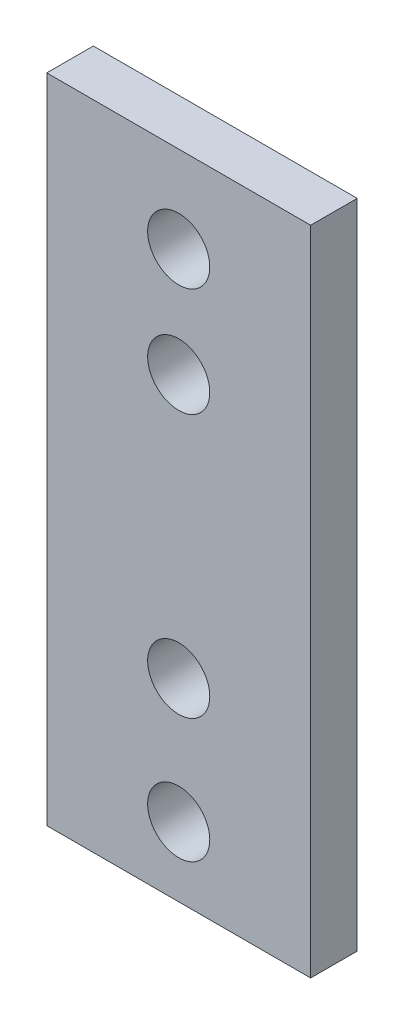
ISO-10303-21;
HEADER;
FILE_DESCRIPTION(('STEP AP214'),'2;1');
FILE_NAME('part.step','',(''),(''),'','','');
FILE_SCHEMA(('AUTOMOTIVE_DESIGN { 1 0 10303 214 1 1 1 1 }'));
ENDSEC;
DATA;
#1=APPLICATION_CONTEXT('core data for automotive mechanical design processes');
#2=APPLICATION_PROTOCOL_DEFINITION('international standard','automotive_design',2000,#1);
#3=PRODUCT_CONTEXT('',#1,'mechanical');
#4=PRODUCT('Part','Part','',(#3));
#5=PRODUCT_RELATED_PRODUCT_CATEGORY('part','',(#4));
#6=PRODUCT_DEFINITION_FORMATION('','',#4);
#7=PRODUCT_DEFINITION_CONTEXT('part definition',#1,'design');
#8=PRODUCT_DEFINITION('design','',#6,#7);
#9=PRODUCT_DEFINITION_SHAPE('','',#8);
#10=(LENGTH_UNIT() NAMED_UNIT(*) SI_UNIT(.MILLI.,.METRE.));
#11=(NAMED_UNIT(*) PLANE_ANGLE_UNIT() SI_UNIT($,.RADIAN.));
#12=(NAMED_UNIT(*) SI_UNIT($,.STERADIAN.) SOLID_ANGLE_UNIT());
#13=UNCERTAINTY_MEASURE_WITH_UNIT(LENGTH_MEASURE(1.E-05),#10,'distance_accuracy_value','');
#14=(GEOMETRIC_REPRESENTATION_CONTEXT(3) GLOBAL_UNCERTAINTY_ASSIGNED_CONTEXT((#13)) GLOBAL_UNIT_ASSIGNED_CONTEXT((#10,
#11,#12)) REPRESENTATION_CONTEXT('',''));
#15=CARTESIAN_POINT('',(0.,0.,0.));
#16=DIRECTION('',(0.,0.,1.));
#17=DIRECTION('',(1.,0.,0.));
#18=AXIS2_PLACEMENT_3D('',#15,#16,#17);
#19=CARTESIAN_POINT('',(0.,0.,3.));
#20=DIRECTION('',(0.,0.,1.));
#21=DIRECTION('',(1.,0.,0.));
#22=AXIS2_PLACEMENT_3D('',#19,#20,#21);
#23=PLANE('',#22);
#24=CARTESIAN_POINT('',(-5.84751773049646,-14.0035460992908,3.));
#25=DIRECTION('',(0.,0.,1.));
#26=DIRECTION('',(1.,0.,0.));
#27=AXIS2_PLACEMENT_3D('',#24,#25,#26);
#28=CIRCLE('',#27,2.);
#29=CARTESIAN_POINT('',(-3.84751773049646,-14.0035460992908,3.));
#30=VERTEX_POINT('',#29);
#31=EDGE_CURVE('E142',#30,#30,#28,.T.);
#32=ORIENTED_EDGE('',*,*,#31,.F.);
#33=EDGE_LOOP('',(#32));
#34=FACE_BOUND('',#33,.T.);
#35=CARTESIAN_POINT('',(-5.84751773049647,9.95390070921986,3.));
#36=DIRECTION('',(0.,0.,1.));
#37=DIRECTION('',(1.,0.,0.));
#38=AXIS2_PLACEMENT_3D('',#35,#36,#37);
#39=CIRCLE('',#38,2.);
#40=CARTESIAN_POINT('',(-3.84751773049647,9.95390070921986,3.));
#41=VERTEX_POINT('',#40);
#42=EDGE_CURVE('E112',#41,#41,#39,.T.);
#43=ORIENTED_EDGE('',*,*,#42,.F.);
#44=EDGE_LOOP('',(#43));
#45=FACE_BOUND('',#44,.T.);
#46=DIRECTION('',(0.,-1.,0.));
#47=VECTOR('',#46,1.);
#48=CARTESIAN_POINT('',(-14.3475177304965,15.5354609929078,3.));
#49=LINE('',#48,#47);
#50=CARTESIAN_POINT('',(-14.3475177304965,15.5354609929078,3.));
#51=VERTEX_POINT('',#50);
#52=CARTESIAN_POINT('',(-14.3475177304965,-26.4645390070922,3.));
#53=VERTEX_POINT('',#52);
#54=EDGE_CURVE('E92',#51,#53,#49,.T.);
#55=ORIENTED_EDGE('',*,*,#54,.T.);
#56=DIRECTION('',(1.,0.,0.));
#57=VECTOR('',#56,1.);
#58=CARTESIAN_POINT('',(-14.3475177304965,-26.4645390070922,3.));
#59=LINE('',#58,#57);
#60=CARTESIAN_POINT('',(2.65248226950354,-26.4645390070922,3.));
#61=VERTEX_POINT('',#60);
#62=EDGE_CURVE('E87',#53,#61,#59,.T.);
#63=ORIENTED_EDGE('',*,*,#62,.T.);
#64=DIRECTION('',(0.,1.,0.));
#65=VECTOR('',#64,1.);
#66=CARTESIAN_POINT('',(2.65248226950353,15.5354609929078,3.));
#67=LINE('',#66,#65);
#68=CARTESIAN_POINT('',(2.65248226950353,15.5354609929078,3.));
#69=VERTEX_POINT('',#68);
#70=EDGE_CURVE('E90',#61,#69,#67,.T.);
#71=ORIENTED_EDGE('',*,*,#70,.T.);
#72=DIRECTION('',(-1.,0.,0.));
#73=VECTOR('',#72,1.);
#74=CARTESIAN_POINT('',(-14.3475177304965,15.5354609929078,3.));
#75=LINE('',#74,#73);
#76=EDGE_CURVE('E57',#69,#51,#75,.T.);
#77=ORIENTED_EDGE('',*,*,#76,.T.);
#78=EDGE_LOOP('',(#55,#63,#71,#77));
#79=FACE_BOUND('',#78,.T.);
#80=CARTESIAN_POINT('',(-5.84751773049647,2.95390070921986,3.));
#81=DIRECTION('',(0.,0.,1.));
#82=DIRECTION('',(1.,0.,0.));
#83=AXIS2_PLACEMENT_3D('',#80,#81,#82);
#84=CIRCLE('',#83,2.);
#85=CARTESIAN_POINT('',(-3.84751773049647,2.95390070921986,3.));
#86=VERTEX_POINT('',#85);
#87=EDGE_CURVE('E134',#86,#86,#84,.T.);
#88=ORIENTED_EDGE('',*,*,#87,.F.);
#89=EDGE_LOOP('',(#88));
#90=FACE_BOUND('',#89,.T.);
#91=CARTESIAN_POINT('',(-5.84751773049646,-22.0035460992908,3.));
#92=DIRECTION('',(0.,0.,1.));
#93=DIRECTION('',(1.,0.,0.));
#94=AXIS2_PLACEMENT_3D('',#91,#92,#93);
#95=CIRCLE('',#94,2.);
#96=CARTESIAN_POINT('',(-3.84751773049646,-22.0035460992908,3.));
#97=VERTEX_POINT('',#96);
#98=EDGE_CURVE('E150',#97,#97,#95,.T.);
#99=ORIENTED_EDGE('',*,*,#98,.F.);
#100=EDGE_LOOP('',(#99));
#101=FACE_BOUND('',#100,.T.);
#102=ADVANCED_FACE('F39',(#34,#45,#79,#90,#101),#23,.T.);
#103=CARTESIAN_POINT('',(0.,0.,0.));
#104=DIRECTION('',(0.,0.,1.));
#105=DIRECTION('',(1.,0.,0.));
#106=AXIS2_PLACEMENT_3D('',#103,#104,#105);
#107=PLANE('',#106);
#108=DIRECTION('',(0.,-1.,0.));
#109=VECTOR('',#108,1.);
#110=CARTESIAN_POINT('',(-14.3475177304965,15.5354609929078,0.));
#111=LINE('',#110,#109);
#112=CARTESIAN_POINT('',(-14.3475177304965,15.5354609929078,0.));
#113=VERTEX_POINT('',#112);
#114=CARTESIAN_POINT('',(-14.3475177304965,-26.4645390070922,0.));
#115=VERTEX_POINT('',#114);
#116=EDGE_CURVE('E108',#113,#115,#111,.T.);
#117=ORIENTED_EDGE('',*,*,#116,.F.);
#118=DIRECTION('',(-1.,0.,0.));
#119=VECTOR('',#118,1.);
#120=CARTESIAN_POINT('',(-14.3475177304965,15.5354609929078,0.));
#121=LINE('',#120,#119);
#122=CARTESIAN_POINT('',(2.65248226950353,15.5354609929078,0.));
#123=VERTEX_POINT('',#122);
#124=EDGE_CURVE('E80',#123,#113,#121,.T.);
#125=ORIENTED_EDGE('',*,*,#124,.F.);
#126=DIRECTION('',(0.,1.,0.));
#127=VECTOR('',#126,1.);
#128=CARTESIAN_POINT('',(2.65248226950353,15.5354609929078,0.));
#129=LINE('',#128,#127);
#130=CARTESIAN_POINT('',(2.65248226950354,-26.4645390070922,0.));
#131=VERTEX_POINT('',#130);
#132=EDGE_CURVE('E74',#131,#123,#129,.T.);
#133=ORIENTED_EDGE('',*,*,#132,.F.);
#134=DIRECTION('',(1.,0.,0.));
#135=VECTOR('',#134,1.);
#136=CARTESIAN_POINT('',(-14.3475177304965,-26.4645390070922,0.));
#137=LINE('',#136,#135);
#138=EDGE_CURVE('E97',#115,#131,#137,.T.);
#139=ORIENTED_EDGE('',*,*,#138,.F.);
#140=EDGE_LOOP('',(#117,#125,#133,#139));
#141=FACE_BOUND('',#140,.T.);
#142=CARTESIAN_POINT('',(-5.84751773049647,9.95390070921986,0.));
#143=DIRECTION('',(0.,0.,1.));
#144=DIRECTION('',(1.,0.,0.));
#145=AXIS2_PLACEMENT_3D('',#142,#143,#144);
#146=CIRCLE('',#145,2.);
#147=CARTESIAN_POINT('',(-3.84751773049647,9.95390070921986,0.));
#148=VERTEX_POINT('',#147);
#149=EDGE_CURVE('E130',#148,#148,#146,.T.);
#150=ORIENTED_EDGE('',*,*,#149,.T.);
#151=EDGE_LOOP('',(#150));
#152=FACE_BOUND('',#151,.T.);
#153=CARTESIAN_POINT('',(-5.84751773049647,2.95390070921986,0.));
#154=DIRECTION('',(0.,0.,1.));
#155=DIRECTION('',(1.,0.,0.));
#156=AXIS2_PLACEMENT_3D('',#153,#154,#155);
#157=CIRCLE('',#156,2.);
#158=CARTESIAN_POINT('',(-3.84751773049647,2.95390070921986,0.));
#159=VERTEX_POINT('',#158);
#160=EDGE_CURVE('E138',#159,#159,#157,.T.);
#161=ORIENTED_EDGE('',*,*,#160,.T.);
#162=EDGE_LOOP('',(#161));
#163=FACE_BOUND('',#162,.T.);
#164=CARTESIAN_POINT('',(-5.84751773049646,-14.0035460992908,0.));
#165=DIRECTION('',(0.,0.,1.));
#166=DIRECTION('',(1.,0.,0.));
#167=AXIS2_PLACEMENT_3D('',#164,#165,#166);
#168=CIRCLE('',#167,2.);
#169=CARTESIAN_POINT('',(-3.84751773049646,-14.0035460992908,0.));
#170=VERTEX_POINT('',#169);
#171=EDGE_CURVE('E146',#170,#170,#168,.T.);
#172=ORIENTED_EDGE('',*,*,#171,.T.);
#173=EDGE_LOOP('',(#172));
#174=FACE_BOUND('',#173,.T.);
#175=CARTESIAN_POINT('',(-5.84751773049646,-22.0035460992908,0.));
#176=DIRECTION('',(0.,0.,1.));
#177=DIRECTION('',(1.,0.,0.));
#178=AXIS2_PLACEMENT_3D('',#175,#176,#177);
#179=CIRCLE('',#178,2.);
#180=CARTESIAN_POINT('',(-3.84751773049646,-22.0035460992908,0.));
#181=VERTEX_POINT('',#180);
#182=EDGE_CURVE('E154',#181,#181,#179,.T.);
#183=ORIENTED_EDGE('',*,*,#182,.T.);
#184=EDGE_LOOP('',(#183));
#185=FACE_BOUND('',#184,.T.);
#186=ADVANCED_FACE('F125',(#141,#152,#163,#174,#185),#107,.F.);
#187=CARTESIAN_POINT('',(-14.3475177304965,15.5354609929078,3.));
#188=DIRECTION('',(1.,0.,0.));
#189=DIRECTION('',(0.,1.,0.));
#190=AXIS2_PLACEMENT_3D('',#187,#188,#189);
#191=PLANE('',#190);
#192=ORIENTED_EDGE('',*,*,#116,.T.);
#193=DIRECTION('',(0.,0.,-1.));
#194=VECTOR('',#193,1.);
#195=CARTESIAN_POINT('',(-14.3475177304965,-26.4645390070922,3.));
#196=LINE('',#195,#194);
#197=EDGE_CURVE('E11',#53,#115,#196,.T.);
#198=ORIENTED_EDGE('',*,*,#197,.F.);
#199=ORIENTED_EDGE('',*,*,#54,.F.);
#200=DIRECTION('',(0.,0.,-1.));
#201=VECTOR('',#200,1.);
#202=CARTESIAN_POINT('',(-14.3475177304965,15.5354609929078,3.));
#203=LINE('',#202,#201);
#204=EDGE_CURVE('E104',#51,#113,#203,.T.);
#205=ORIENTED_EDGE('',*,*,#204,.T.);
#206=EDGE_LOOP('',(#192,#198,#199,#205));
#207=FACE_BOUND('',#206,.T.);
#208=ADVANCED_FACE('F41',(#207),#191,.F.);
#209=CARTESIAN_POINT('',(-14.3475177304965,-26.4645390070922,3.));
#210=DIRECTION('',(0.,1.,0.));
#211=DIRECTION('',(0.,0.,1.));
#212=AXIS2_PLACEMENT_3D('',#209,#210,#211);
#213=PLANE('',#212);
#214=ORIENTED_EDGE('',*,*,#138,.T.);
#215=DIRECTION('',(0.,0.,-1.));
#216=VECTOR('',#215,1.);
#217=CARTESIAN_POINT('',(2.65248226950354,-26.4645390070922,3.));
#218=LINE('',#217,#216);
#219=EDGE_CURVE('E49',#61,#131,#218,.T.);
#220=ORIENTED_EDGE('',*,*,#219,.F.);
#221=ORIENTED_EDGE('',*,*,#62,.F.);
#222=ORIENTED_EDGE('',*,*,#197,.T.);
#223=EDGE_LOOP('',(#214,#220,#221,#222));
#224=FACE_BOUND('',#223,.T.);
#225=ADVANCED_FACE('F96',(#224),#213,.F.);
#226=CARTESIAN_POINT('',(2.65248226950353,15.5354609929078,3.));
#227=DIRECTION('',(-1.,0.,0.));
#228=DIRECTION('',(0.,-1.,0.));
#229=AXIS2_PLACEMENT_3D('',#226,#227,#228);
#230=PLANE('',#229);
#231=ORIENTED_EDGE('',*,*,#132,.T.);
#232=DIRECTION('',(0.,0.,-1.));
#233=VECTOR('',#232,1.);
#234=CARTESIAN_POINT('',(2.65248226950353,15.5354609929078,3.));
#235=LINE('',#234,#233);
#236=EDGE_CURVE('E99',#69,#123,#235,.T.);
#237=ORIENTED_EDGE('',*,*,#236,.F.);
#238=ORIENTED_EDGE('',*,*,#70,.F.);
#239=ORIENTED_EDGE('',*,*,#219,.T.);
#240=EDGE_LOOP('',(#231,#237,#238,#239));
#241=FACE_BOUND('',#240,.T.);
#242=ADVANCED_FACE('F100',(#241),#230,.F.);
#243=CARTESIAN_POINT('',(-14.3475177304965,15.5354609929078,3.));
#244=DIRECTION('',(0.,-1.,0.));
#245=DIRECTION('',(0.,0.,-1.));
#246=AXIS2_PLACEMENT_3D('',#243,#244,#245);
#247=PLANE('',#246);
#248=ORIENTED_EDGE('',*,*,#124,.T.);
#249=ORIENTED_EDGE('',*,*,#204,.F.);
#250=ORIENTED_EDGE('',*,*,#76,.F.);
#251=ORIENTED_EDGE('',*,*,#236,.T.);
#252=EDGE_LOOP('',(#248,#249,#250,#251));
#253=FACE_BOUND('',#252,.T.);
#254=ADVANCED_FACE('F122',(#253),#247,.F.);
#255=CARTESIAN_POINT('',(-5.84751773049647,9.95390070921986,3.));
#256=DIRECTION('',(0.,0.,-1.));
#257=DIRECTION('',(-1.,0.,0.));
#258=AXIS2_PLACEMENT_3D('',#255,#256,#257);
#259=CYLINDRICAL_SURFACE('',#258,2.);
#260=ORIENTED_EDGE('',*,*,#42,.T.);
#261=EDGE_LOOP('',(#260));
#262=FACE_BOUND('',#261,.T.);
#263=ORIENTED_EDGE('',*,*,#149,.F.);
#264=EDGE_LOOP('',(#263));
#265=FACE_BOUND('',#264,.T.);
#266=ADVANCED_FACE('F175',(#262,#265),#259,.F.);
#267=CARTESIAN_POINT('',(-5.84751773049647,2.95390070921986,3.));
#268=DIRECTION('',(0.,0.,-1.));
#269=DIRECTION('',(-1.,0.,0.));
#270=AXIS2_PLACEMENT_3D('',#267,#268,#269);
#271=CYLINDRICAL_SURFACE('',#270,2.);
#272=ORIENTED_EDGE('',*,*,#87,.T.);
#273=EDGE_LOOP('',(#272));
#274=FACE_BOUND('',#273,.T.);
#275=ORIENTED_EDGE('',*,*,#160,.F.);
#276=EDGE_LOOP('',(#275));
#277=FACE_BOUND('',#276,.T.);
#278=ADVANCED_FACE('F221',(#274,#277),#271,.F.);
#279=CARTESIAN_POINT('',(-5.84751773049646,-14.0035460992908,3.));
#280=DIRECTION('',(0.,0.,-1.));
#281=DIRECTION('',(-1.,0.,0.));
#282=AXIS2_PLACEMENT_3D('',#279,#280,#281);
#283=CYLINDRICAL_SURFACE('',#282,2.);
#284=ORIENTED_EDGE('',*,*,#31,.T.);
#285=EDGE_LOOP('',(#284));
#286=FACE_BOUND('',#285,.T.);
#287=ORIENTED_EDGE('',*,*,#171,.F.);
#288=EDGE_LOOP('',(#287));
#289=FACE_BOUND('',#288,.T.);
#290=ADVANCED_FACE('F229',(#286,#289),#283,.F.);
#291=CARTESIAN_POINT('',(-5.84751773049646,-22.0035460992908,3.));
#292=DIRECTION('',(0.,0.,-1.));
#293=DIRECTION('',(-1.,0.,0.));
#294=AXIS2_PLACEMENT_3D('',#291,#292,#293);
#295=CYLINDRICAL_SURFACE('',#294,2.);
#296=ORIENTED_EDGE('',*,*,#98,.T.);
#297=EDGE_LOOP('',(#296));
#298=FACE_BOUND('',#297,.T.);
#299=ORIENTED_EDGE('',*,*,#182,.F.);
#300=EDGE_LOOP('',(#299));
#301=FACE_BOUND('',#300,.T.);
#302=ADVANCED_FACE('F162',(#298,#301),#295,.F.);
#303=CLOSED_SHELL('',(#102,#186,#208,#225,#242,#254,#266,#278,#290,#302));
#304=MANIFOLD_SOLID_BREP('B2',#303);
#305=ADVANCED_BREP_SHAPE_REPRESENTATION('',(#18,#304),#14);
#306=SHAPE_DEFINITION_REPRESENTATION(#9,#305);
ENDSEC;
END-ISO-10303-21;
